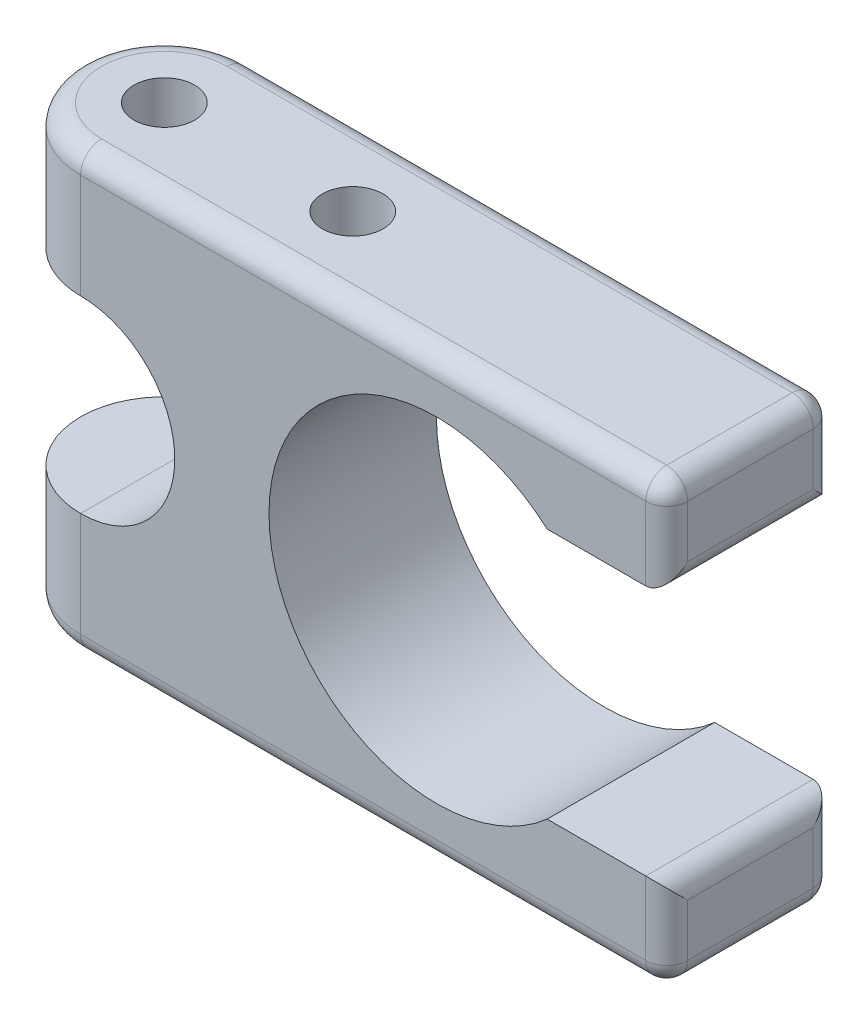
ISO-10303-21;
HEADER;
FILE_DESCRIPTION(('STEP AP214'),'2;1');
FILE_NAME('part.step','',(''),(''),'','','');
FILE_SCHEMA(('AUTOMOTIVE_DESIGN { 1 0 10303 214 1 1 1 1 }'));
ENDSEC;
DATA;
#1=APPLICATION_CONTEXT('core data for automotive mechanical design processes');
#2=APPLICATION_PROTOCOL_DEFINITION('international standard','automotive_design',2000,#1);
#3=PRODUCT_CONTEXT('',#1,'mechanical');
#4=PRODUCT('Part','Part','',(#3));
#5=PRODUCT_RELATED_PRODUCT_CATEGORY('part','',(#4));
#6=PRODUCT_DEFINITION_FORMATION('','',#4);
#7=PRODUCT_DEFINITION_CONTEXT('part definition',#1,'design');
#8=PRODUCT_DEFINITION('design','',#6,#7);
#9=PRODUCT_DEFINITION_SHAPE('','',#8);
#10=(LENGTH_UNIT() NAMED_UNIT(*) SI_UNIT(.MILLI.,.METRE.));
#11=(NAMED_UNIT(*) PLANE_ANGLE_UNIT() SI_UNIT($,.RADIAN.));
#12=(NAMED_UNIT(*) SI_UNIT($,.STERADIAN.) SOLID_ANGLE_UNIT());
#13=UNCERTAINTY_MEASURE_WITH_UNIT(LENGTH_MEASURE(1.E-05),#10,'distance_accuracy_value','');
#14=(GEOMETRIC_REPRESENTATION_CONTEXT(3) GLOBAL_UNCERTAINTY_ASSIGNED_CONTEXT((#13)) GLOBAL_UNIT_ASSIGNED_CONTEXT((#10,
#11,#12)) REPRESENTATION_CONTEXT('',''));
#15=CARTESIAN_POINT('',(0.,0.,0.));
#16=DIRECTION('',(0.,0.,1.));
#17=DIRECTION('',(1.,0.,0.));
#18=AXIS2_PLACEMENT_3D('',#15,#16,#17);
#19=CARTESIAN_POINT('',(-12.,10.5,4.));
#20=DIRECTION('',(0.,-1.,0.));
#21=DIRECTION('',(1.,0.,0.));
#22=AXIS2_PLACEMENT_3D('',#19,#20,#21);
#23=CYLINDRICAL_SURFACE('',#22,4.);
#24=DIRECTION('',(0.,1.,0.));
#25=VECTOR('',#24,1.);
#26=CARTESIAN_POINT('',(-12.,10.5,0.));
#27=LINE('',#26,#25);
#28=CARTESIAN_POINT('',(-12.,4.5,0.));
#29=VERTEX_POINT('',#28);
#30=CARTESIAN_POINT('',(-12.,9.5,0.));
#31=VERTEX_POINT('',#30);
#32=EDGE_CURVE('E203',#29,#31,#27,.T.);
#33=ORIENTED_EDGE('',*,*,#32,.F.);
#34=CARTESIAN_POINT('',(-12.,4.5,4.));
#35=DIRECTION('',(0.,-1.,0.));
#36=DIRECTION('',(1.,0.,0.));
#37=AXIS2_PLACEMENT_3D('',#34,#35,#36);
#38=CIRCLE('',#37,4.);
#39=CARTESIAN_POINT('',(-12.,4.5,8.));
#40=VERTEX_POINT('',#39);
#41=EDGE_CURVE('E182',#40,#29,#38,.T.);
#42=ORIENTED_EDGE('',*,*,#41,.F.);
#43=DIRECTION('',(0.,-1.,0.));
#44=VECTOR('',#43,1.);
#45=CARTESIAN_POINT('',(-12.,0.,8.));
#46=LINE('',#45,#44);
#47=CARTESIAN_POINT('',(-12.,9.5,8.));
#48=VERTEX_POINT('',#47);
#49=EDGE_CURVE('E207',#48,#40,#46,.T.);
#50=ORIENTED_EDGE('',*,*,#49,.F.);
#51=CARTESIAN_POINT('',(-12.,9.5,4.));
#52=DIRECTION('',(0.,-1.,0.));
#53=DIRECTION('',(1.,0.,0.));
#54=AXIS2_PLACEMENT_3D('',#51,#52,#53);
#55=CIRCLE('',#54,4.);
#56=EDGE_CURVE('E225',#48,#31,#55,.T.);
#57=ORIENTED_EDGE('',*,*,#56,.T.);
#58=EDGE_LOOP('',(#33,#42,#50,#57));
#59=FACE_BOUND('',#58,.T.);
#60=ADVANCED_FACE('F37',(#59),#23,.T.);
#61=CARTESIAN_POINT('',(-12.,-4.5,8.));
#62=VERTEX_POINT('',#61);
#63=CARTESIAN_POINT('',(-12.,-9.5,8.));
#64=VERTEX_POINT('',#63);
#65=EDGE_CURVE('E196',#62,#64,#46,.T.);
#66=ORIENTED_EDGE('',*,*,#65,.F.);
#67=CARTESIAN_POINT('',(-12.,-4.5,4.));
#68=DIRECTION('',(0.,1.,0.));
#69=DIRECTION('',(-1.,0.,0.));
#70=AXIS2_PLACEMENT_3D('',#67,#68,#69);
#71=CIRCLE('',#70,4.);
#72=CARTESIAN_POINT('',(-12.,-4.5,0.));
#73=VERTEX_POINT('',#72);
#74=EDGE_CURVE('E187',#73,#62,#71,.T.);
#75=ORIENTED_EDGE('',*,*,#74,.F.);
#76=CARTESIAN_POINT('',(-12.,-9.50000000000001,0.));
#77=VERTEX_POINT('',#76);
#78=EDGE_CURVE('E195',#77,#73,#27,.T.);
#79=ORIENTED_EDGE('',*,*,#78,.F.);
#80=CARTESIAN_POINT('',(-12.,-9.50000000000001,4.));
#81=DIRECTION('',(0.,1.,0.));
#82=DIRECTION('',(-1.,0.,0.));
#83=AXIS2_PLACEMENT_3D('',#80,#81,#82);
#84=CIRCLE('',#83,4.);
#85=EDGE_CURVE('E228',#77,#64,#84,.T.);
#86=ORIENTED_EDGE('',*,*,#85,.T.);
#87=EDGE_LOOP('',(#66,#75,#79,#86));
#88=FACE_BOUND('',#87,.T.);
#89=ADVANCED_FACE('F193',(#88),#23,.T.);
#90=CARTESIAN_POINT('',(16.,10.5,8.));
#91=DIRECTION('',(-1.,0.,0.));
#92=DIRECTION('',(0.,-1.,0.));
#93=AXIS2_PLACEMENT_3D('',#90,#91,#92);
#94=PLANE('',#93);
#95=DIRECTION('',(0.,1.,0.));
#96=VECTOR('',#95,1.);
#97=CARTESIAN_POINT('',(16.,-5.99999999999999,1.));
#98=LINE('',#97,#96);
#99=CARTESIAN_POINT('',(16.,-9.5,1.));
#100=VERTEX_POINT('',#99);
#101=CARTESIAN_POINT('',(16.,-7.,1.));
#102=VERTEX_POINT('',#101);
#103=EDGE_CURVE('E251',#100,#102,#98,.T.);
#104=ORIENTED_EDGE('',*,*,#103,.T.);
#105=DIRECTION('',(0.,0.,1.));
#106=VECTOR('',#105,1.);
#107=CARTESIAN_POINT('',(16.,-7.,8.));
#108=LINE('',#107,#106);
#109=CARTESIAN_POINT('',(16.,-7.,7.));
#110=VERTEX_POINT('',#109);
#111=EDGE_CURVE('E254',#102,#110,#108,.T.);
#112=ORIENTED_EDGE('',*,*,#111,.T.);
#113=DIRECTION('',(0.,1.,0.));
#114=VECTOR('',#113,1.);
#115=CARTESIAN_POINT('',(16.,10.5,7.));
#116=LINE('',#115,#114);
#117=CARTESIAN_POINT('',(16.,-9.5,7.));
#118=VERTEX_POINT('',#117);
#119=EDGE_CURVE('E249',#110,#118,#116,.F.);
#120=ORIENTED_EDGE('',*,*,#119,.T.);
#121=DIRECTION('',(0.,0.,-1.));
#122=VECTOR('',#121,1.);
#123=CARTESIAN_POINT('',(16.,-9.5,8.));
#124=LINE('',#123,#122);
#125=EDGE_CURVE('E247',#118,#100,#124,.T.);
#126=ORIENTED_EDGE('',*,*,#125,.T.);
#127=EDGE_LOOP('',(#104,#112,#120,#126));
#128=FACE_BOUND('',#127,.T.);
#129=ADVANCED_FACE('F424',(#128),#94,.F.);
#130=CARTESIAN_POINT('',(16.,-10.5,8.));
#131=DIRECTION('',(0.,1.,0.));
#132=DIRECTION('',(-1.,0.,0.));
#133=AXIS2_PLACEMENT_3D('',#130,#131,#132);
#134=PLANE('',#133);
#135=CARTESIAN_POINT('',(-12.,-10.5,4.));
#136=DIRECTION('',(0.,-1.,0.));
#137=DIRECTION('',(0.,0.,-1.));
#138=AXIS2_PLACEMENT_3D('',#135,#136,#137);
#139=CIRCLE('',#138,1.44999999999999);
#140=CARTESIAN_POINT('',(-12.,-10.5,2.55000000000001));
#141=VERTEX_POINT('',#140);
#142=EDGE_CURVE('E403',#141,#141,#139,.T.);
#143=ORIENTED_EDGE('',*,*,#142,.F.);
#144=EDGE_LOOP('',(#143));
#145=FACE_BOUND('',#144,.T.);
#146=CARTESIAN_POINT('',(-3.,-10.5,4.));
#147=DIRECTION('',(0.,-1.,0.));
#148=DIRECTION('',(0.,0.,-1.));
#149=AXIS2_PLACEMENT_3D('',#146,#147,#148);
#150=CIRCLE('',#149,1.44999999999999);
#151=CARTESIAN_POINT('',(-3.,-10.5,2.55000000000001));
#152=VERTEX_POINT('',#151);
#153=EDGE_CURVE('E397',#152,#152,#150,.T.);
#154=ORIENTED_EDGE('',*,*,#153,.F.);
#155=EDGE_LOOP('',(#154));
#156=FACE_BOUND('',#155,.T.);
#157=CARTESIAN_POINT('',(-12.,-10.5,4.));
#158=DIRECTION('',(0.,1.,0.));
#159=DIRECTION('',(-1.,0.,0.));
#160=AXIS2_PLACEMENT_3D('',#157,#158,#159);
#161=CIRCLE('',#160,3.);
#162=CARTESIAN_POINT('',(-12.,-10.5,7.));
#163=VERTEX_POINT('',#162);
#164=CARTESIAN_POINT('',(-12.,-10.5,1.));
#165=VERTEX_POINT('',#164);
#166=EDGE_CURVE('E212',#163,#165,#161,.F.);
#167=ORIENTED_EDGE('',*,*,#166,.T.);
#168=DIRECTION('',(1.,0.,0.));
#169=VECTOR('',#168,1.);
#170=CARTESIAN_POINT('',(16.,-10.5,1.));
#171=LINE('',#170,#169);
#172=CARTESIAN_POINT('',(15.,-10.5,1.));
#173=VERTEX_POINT('',#172);
#174=EDGE_CURVE('E214',#165,#173,#171,.T.);
#175=ORIENTED_EDGE('',*,*,#174,.T.);
#176=DIRECTION('',(0.,0.,-1.));
#177=VECTOR('',#176,1.);
#178=CARTESIAN_POINT('',(15.,-10.5,8.));
#179=LINE('',#178,#177);
#180=CARTESIAN_POINT('',(15.,-10.5,7.));
#181=VERTEX_POINT('',#180);
#182=EDGE_CURVE('E205',#173,#181,#179,.F.);
#183=ORIENTED_EDGE('',*,*,#182,.T.);
#184=DIRECTION('',(1.,0.,0.));
#185=VECTOR('',#184,1.);
#186=CARTESIAN_POINT('',(16.,-10.5,7.));
#187=LINE('',#186,#185);
#188=EDGE_CURVE('E202',#181,#163,#187,.F.);
#189=ORIENTED_EDGE('',*,*,#188,.T.);
#190=EDGE_LOOP('',(#167,#175,#183,#189));
#191=FACE_BOUND('',#190,.T.);
#192=ADVANCED_FACE('F430',(#145,#156,#191),#134,.F.);
#193=DIRECTION('',(0.,1.,0.));
#194=VECTOR('',#193,1.);
#195=CARTESIAN_POINT('',(16.,10.5,7.));
#196=LINE('',#195,#194);
#197=CARTESIAN_POINT('',(16.,9.5,7.));
#198=VERTEX_POINT('',#197);
#199=CARTESIAN_POINT('',(16.,7.,7.));
#200=VERTEX_POINT('',#199);
#201=EDGE_CURVE('E262',#198,#200,#196,.F.);
#202=ORIENTED_EDGE('',*,*,#201,.T.);
#203=DIRECTION('',(0.,0.,1.));
#204=VECTOR('',#203,1.);
#205=CARTESIAN_POINT('',(16.,7.,8.));
#206=LINE('',#205,#204);
#207=CARTESIAN_POINT('',(16.,7.,1.));
#208=VERTEX_POINT('',#207);
#209=EDGE_CURVE('E11',#200,#208,#206,.F.);
#210=ORIENTED_EDGE('',*,*,#209,.T.);
#211=DIRECTION('',(0.,1.,0.));
#212=VECTOR('',#211,1.);
#213=CARTESIAN_POINT('',(16.,10.5,1.));
#214=LINE('',#213,#212);
#215=CARTESIAN_POINT('',(16.,9.5,1.));
#216=VERTEX_POINT('',#215);
#217=EDGE_CURVE('E46',#208,#216,#214,.T.);
#218=ORIENTED_EDGE('',*,*,#217,.T.);
#219=DIRECTION('',(0.,0.,-1.));
#220=VECTOR('',#219,1.);
#221=CARTESIAN_POINT('',(16.,9.5,8.));
#222=LINE('',#221,#220);
#223=EDGE_CURVE('E260',#216,#198,#222,.F.);
#224=ORIENTED_EDGE('',*,*,#223,.T.);
#225=EDGE_LOOP('',(#202,#210,#218,#224));
#226=FACE_BOUND('',#225,.T.);
#227=ADVANCED_FACE('F604',(#226),#94,.F.);
#228=CARTESIAN_POINT('',(16.,10.5,8.));
#229=DIRECTION('',(0.,-1.,0.));
#230=DIRECTION('',(1.,0.,0.));
#231=AXIS2_PLACEMENT_3D('',#228,#229,#230);
#232=PLANE('',#231);
#233=DIRECTION('',(-1.,0.,0.));
#234=VECTOR('',#233,1.);
#235=CARTESIAN_POINT('',(16.,10.5,7.));
#236=LINE('',#235,#234);
#237=CARTESIAN_POINT('',(-12.,10.5,7.));
#238=VERTEX_POINT('',#237);
#239=CARTESIAN_POINT('',(15.,10.5,7.));
#240=VERTEX_POINT('',#239);
#241=EDGE_CURVE('E232',#238,#240,#236,.F.);
#242=ORIENTED_EDGE('',*,*,#241,.T.);
#243=DIRECTION('',(0.,0.,-1.));
#244=VECTOR('',#243,1.);
#245=CARTESIAN_POINT('',(15.,10.5,8.));
#246=LINE('',#245,#244);
#247=CARTESIAN_POINT('',(15.,10.5,1.));
#248=VERTEX_POINT('',#247);
#249=EDGE_CURVE('E237',#240,#248,#246,.T.);
#250=ORIENTED_EDGE('',*,*,#249,.T.);
#251=DIRECTION('',(-1.,0.,0.));
#252=VECTOR('',#251,1.);
#253=CARTESIAN_POINT('',(-12.,10.5,1.));
#254=LINE('',#253,#252);
#255=CARTESIAN_POINT('',(-12.,10.5,1.));
#256=VERTEX_POINT('',#255);
#257=EDGE_CURVE('E234',#248,#256,#254,.T.);
#258=ORIENTED_EDGE('',*,*,#257,.T.);
#259=CARTESIAN_POINT('',(-12.,10.5,4.));
#260=DIRECTION('',(0.,-1.,0.));
#261=DIRECTION('',(1.,0.,0.));
#262=AXIS2_PLACEMENT_3D('',#259,#260,#261);
#263=CIRCLE('',#262,3.);
#264=EDGE_CURVE('E230',#256,#238,#263,.F.);
#265=ORIENTED_EDGE('',*,*,#264,.T.);
#266=EDGE_LOOP('',(#242,#250,#258,#265));
#267=FACE_BOUND('',#266,.T.);
#268=CARTESIAN_POINT('',(-12.,10.5,4.));
#269=DIRECTION('',(0.,1.,0.));
#270=DIRECTION('',(0.,0.,1.));
#271=AXIS2_PLACEMENT_3D('',#268,#269,#270);
#272=CIRCLE('',#271,1.44999999999999);
#273=CARTESIAN_POINT('',(-12.,10.5,5.44999999999999));
#274=VERTEX_POINT('',#273);
#275=EDGE_CURVE('E292',#274,#274,#272,.T.);
#276=ORIENTED_EDGE('',*,*,#275,.F.);
#277=EDGE_LOOP('',(#276));
#278=FACE_BOUND('',#277,.T.);
#279=CARTESIAN_POINT('',(-3.,10.5,4.));
#280=DIRECTION('',(0.,1.,0.));
#281=DIRECTION('',(0.,0.,1.));
#282=AXIS2_PLACEMENT_3D('',#279,#280,#281);
#283=CIRCLE('',#282,1.44999999999999);
#284=CARTESIAN_POINT('',(-3.,10.5,5.44999999999999));
#285=VERTEX_POINT('',#284);
#286=EDGE_CURVE('E385',#285,#285,#283,.T.);
#287=ORIENTED_EDGE('',*,*,#286,.F.);
#288=EDGE_LOOP('',(#287));
#289=FACE_BOUND('',#288,.T.);
#290=ADVANCED_FACE('F597',(#267,#278,#289),#232,.F.);
#291=CARTESIAN_POINT('',(0.,0.,8.));
#292=DIRECTION('',(0.,0.,-1.));
#293=DIRECTION('',(-1.,0.,0.));
#294=AXIS2_PLACEMENT_3D('',#291,#292,#293);
#295=PLANE('',#294);
#296=CARTESIAN_POINT('',(-12.,0.,8.));
#297=DIRECTION('',(0.,0.,-1.));
#298=DIRECTION('',(-1.,0.,0.));
#299=AXIS2_PLACEMENT_3D('',#296,#297,#298);
#300=CIRCLE('',#299,4.5);
#301=EDGE_CURVE('E360',#40,#62,#300,.T.);
#302=ORIENTED_EDGE('',*,*,#301,.T.);
#303=ORIENTED_EDGE('',*,*,#65,.T.);
#304=DIRECTION('',(1.,0.,0.));
#305=VECTOR('',#304,1.);
#306=CARTESIAN_POINT('',(0.,-9.5,8.));
#307=LINE('',#306,#305);
#308=CARTESIAN_POINT('',(15.,-9.5,8.));
#309=VERTEX_POINT('',#308);
#310=EDGE_CURVE('E239',#64,#309,#307,.T.);
#311=ORIENTED_EDGE('',*,*,#310,.T.);
#312=DIRECTION('',(0.,1.,0.));
#313=VECTOR('',#312,1.);
#314=CARTESIAN_POINT('',(15.,0.,8.));
#315=LINE('',#314,#313);
#316=CARTESIAN_POINT('',(15.,-6.,8.));
#317=VERTEX_POINT('',#316);
#318=EDGE_CURVE('E241',#309,#317,#315,.T.);
#319=ORIENTED_EDGE('',*,*,#318,.T.);
#320=DIRECTION('',(1.,0.,0.));
#321=VECTOR('',#320,1.);
#322=CARTESIAN_POINT('',(16.,-6.,8.));
#323=LINE('',#322,#321);
#324=CARTESIAN_POINT('',(10.2915026221292,-6.,8.));
#325=VERTEX_POINT('',#324);
#326=EDGE_CURVE('E345',#325,#317,#323,.T.);
#327=ORIENTED_EDGE('',*,*,#326,.F.);
#328=CARTESIAN_POINT('',(5.,0.,8.));
#329=DIRECTION('',(0.,0.,1.));
#330=DIRECTION('',(1.,0.,0.));
#331=AXIS2_PLACEMENT_3D('',#328,#329,#330);
#332=CIRCLE('',#331,8.);
#333=CARTESIAN_POINT('',(10.2915026221292,6.,8.));
#334=VERTEX_POINT('',#333);
#335=EDGE_CURVE('E339',#334,#325,#332,.T.);
#336=ORIENTED_EDGE('',*,*,#335,.F.);
#337=DIRECTION('',(-1.,0.,0.));
#338=VECTOR('',#337,1.);
#339=CARTESIAN_POINT('',(16.,6.,8.));
#340=LINE('',#339,#338);
#341=CARTESIAN_POINT('',(15.,6.,8.));
#342=VERTEX_POINT('',#341);
#343=EDGE_CURVE('E336',#342,#334,#340,.T.);
#344=ORIENTED_EDGE('',*,*,#343,.F.);
#345=DIRECTION('',(0.,1.,0.));
#346=VECTOR('',#345,1.);
#347=CARTESIAN_POINT('',(15.,0.,8.));
#348=LINE('',#347,#346);
#349=CARTESIAN_POINT('',(15.,9.5,8.));
#350=VERTEX_POINT('',#349);
#351=EDGE_CURVE('E243',#342,#350,#348,.T.);
#352=ORIENTED_EDGE('',*,*,#351,.T.);
#353=DIRECTION('',(-1.,0.,0.));
#354=VECTOR('',#353,1.);
#355=CARTESIAN_POINT('',(0.,9.5,8.));
#356=LINE('',#355,#354);
#357=EDGE_CURVE('E245',#350,#48,#356,.T.);
#358=ORIENTED_EDGE('',*,*,#357,.T.);
#359=ORIENTED_EDGE('',*,*,#49,.T.);
#360=EDGE_LOOP('',(#302,#303,#311,#319,#327,#336,#344,#352,#358,#359));
#361=FACE_BOUND('',#360,.T.);
#362=ADVANCED_FACE('F331',(#361),#295,.F.);
#363=CARTESIAN_POINT('',(0.,0.,0.));
#364=DIRECTION('',(0.,0.,-1.));
#365=DIRECTION('',(-1.,0.,0.));
#366=AXIS2_PLACEMENT_3D('',#363,#364,#365);
#367=PLANE('',#366);
#368=ORIENTED_EDGE('',*,*,#78,.T.);
#369=CARTESIAN_POINT('',(-12.,0.,0.));
#370=DIRECTION('',(0.,0.,1.));
#371=DIRECTION('',(1.,0.,0.));
#372=AXIS2_PLACEMENT_3D('',#369,#370,#371);
#373=CIRCLE('',#372,4.5);
#374=EDGE_CURVE('E174',#73,#29,#373,.T.);
#375=ORIENTED_EDGE('',*,*,#374,.T.);
#376=ORIENTED_EDGE('',*,*,#32,.T.);
#377=DIRECTION('',(-1.,0.,0.));
#378=VECTOR('',#377,1.);
#379=CARTESIAN_POINT('',(16.,9.5,0.));
#380=LINE('',#379,#378);
#381=CARTESIAN_POINT('',(15.,9.5,0.));
#382=VERTEX_POINT('',#381);
#383=EDGE_CURVE('E219',#31,#382,#380,.F.);
#384=ORIENTED_EDGE('',*,*,#383,.T.);
#385=DIRECTION('',(0.,1.,0.));
#386=VECTOR('',#385,1.);
#387=CARTESIAN_POINT('',(15.,6.,0.));
#388=LINE('',#387,#386);
#389=CARTESIAN_POINT('',(15.,6.,0.));
#390=VERTEX_POINT('',#389);
#391=EDGE_CURVE('E217',#382,#390,#388,.F.);
#392=ORIENTED_EDGE('',*,*,#391,.T.);
#393=DIRECTION('',(-1.,0.,0.));
#394=VECTOR('',#393,1.);
#395=CARTESIAN_POINT('',(16.,6.,0.));
#396=LINE('',#395,#394);
#397=CARTESIAN_POINT('',(10.2915026221292,6.,0.));
#398=VERTEX_POINT('',#397);
#399=EDGE_CURVE('E357',#390,#398,#396,.T.);
#400=ORIENTED_EDGE('',*,*,#399,.T.);
#401=CARTESIAN_POINT('',(5.,0.,0.));
#402=DIRECTION('',(0.,0.,-1.));
#403=DIRECTION('',(-1.,0.,0.));
#404=AXIS2_PLACEMENT_3D('',#401,#402,#403);
#405=CIRCLE('',#404,8.);
#406=CARTESIAN_POINT('',(10.2915026221292,-6.,0.));
#407=VERTEX_POINT('',#406);
#408=EDGE_CURVE('E348',#398,#407,#405,.F.);
#409=ORIENTED_EDGE('',*,*,#408,.T.);
#410=DIRECTION('',(1.,0.,0.));
#411=VECTOR('',#410,1.);
#412=CARTESIAN_POINT('',(16.,-6.,0.));
#413=LINE('',#412,#411);
#414=CARTESIAN_POINT('',(15.,-6.,0.));
#415=VERTEX_POINT('',#414);
#416=EDGE_CURVE('E343',#407,#415,#413,.T.);
#417=ORIENTED_EDGE('',*,*,#416,.T.);
#418=DIRECTION('',(0.,1.,0.));
#419=VECTOR('',#418,1.);
#420=CARTESIAN_POINT('',(15.,-10.5,0.));
#421=LINE('',#420,#419);
#422=CARTESIAN_POINT('',(15.,-9.5,0.));
#423=VERTEX_POINT('',#422);
#424=EDGE_CURVE('E222',#415,#423,#421,.F.);
#425=ORIENTED_EDGE('',*,*,#424,.T.);
#426=DIRECTION('',(1.,0.,0.));
#427=VECTOR('',#426,1.);
#428=CARTESIAN_POINT('',(-12.,-9.5,0.));
#429=LINE('',#428,#427);
#430=EDGE_CURVE('E201',#423,#77,#429,.F.);
#431=ORIENTED_EDGE('',*,*,#430,.T.);
#432=EDGE_LOOP('',(#368,#375,#376,#384,#392,#400,#409,#417,#425,#431));
#433=FACE_BOUND('',#432,.T.);
#434=ADVANCED_FACE('F199',(#433),#367,.T.);
#435=CARTESIAN_POINT('',(16.,-6.,-0.000999999999999265));
#436=DIRECTION('',(0.,-1.,0.));
#437=DIRECTION('',(0.,0.,-1.));
#438=AXIS2_PLACEMENT_3D('',#435,#436,#437);
#439=PLANE('',#438);
#440=ORIENTED_EDGE('',*,*,#326,.T.);
#441=DIRECTION('',(0.,0.,1.));
#442=VECTOR('',#441,1.);
#443=CARTESIAN_POINT('',(15.,-6.,-0.000999999999999265));
#444=LINE('',#443,#442);
#445=EDGE_CURVE('E256',#317,#415,#444,.F.);
#446=ORIENTED_EDGE('',*,*,#445,.T.);
#447=ORIENTED_EDGE('',*,*,#416,.F.);
#448=DIRECTION('',(0.,0.,1.));
#449=VECTOR('',#448,1.);
#450=CARTESIAN_POINT('',(10.2915026221292,-6.,-0.000999999999999265));
#451=LINE('',#450,#449);
#452=EDGE_CURVE('E355',#407,#325,#451,.T.);
#453=ORIENTED_EDGE('',*,*,#452,.T.);
#454=EDGE_LOOP('',(#440,#446,#447,#453));
#455=FACE_BOUND('',#454,.T.);
#456=ADVANCED_FACE('F576',(#455),#439,.F.);
#457=CARTESIAN_POINT('',(5.,0.,-0.000999999999999265));
#458=DIRECTION('',(0.,0.,1.));
#459=DIRECTION('',(1.,0.,0.));
#460=AXIS2_PLACEMENT_3D('',#457,#458,#459);
#461=CYLINDRICAL_SURFACE('',#460,8.);
#462=DIRECTION('',(0.,0.,1.));
#463=VECTOR('',#462,1.);
#464=CARTESIAN_POINT('',(10.2915026221292,6.,-0.000999999999999265));
#465=LINE('',#464,#463);
#466=EDGE_CURVE('E354',#398,#334,#465,.T.);
#467=ORIENTED_EDGE('',*,*,#466,.T.);
#468=ORIENTED_EDGE('',*,*,#335,.T.);
#469=ORIENTED_EDGE('',*,*,#452,.F.);
#470=ORIENTED_EDGE('',*,*,#408,.F.);
#471=EDGE_LOOP('',(#467,#468,#469,#470));
#472=FACE_BOUND('',#471,.T.);
#473=ADVANCED_FACE('F382',(#472),#461,.F.);
#474=CARTESIAN_POINT('',(16.,6.,-0.000999999999999265));
#475=DIRECTION('',(0.,1.,0.));
#476=DIRECTION('',(0.,0.,1.));
#477=AXIS2_PLACEMENT_3D('',#474,#475,#476);
#478=PLANE('',#477);
#479=ORIENTED_EDGE('',*,*,#399,.F.);
#480=DIRECTION('',(0.,0.,1.));
#481=VECTOR('',#480,1.);
#482=CARTESIAN_POINT('',(15.,6.,-0.000999999999999265));
#483=LINE('',#482,#481);
#484=EDGE_CURVE('E258',#390,#342,#483,.T.);
#485=ORIENTED_EDGE('',*,*,#484,.T.);
#486=ORIENTED_EDGE('',*,*,#343,.T.);
#487=ORIENTED_EDGE('',*,*,#466,.F.);
#488=EDGE_LOOP('',(#479,#485,#486,#487));
#489=FACE_BOUND('',#488,.T.);
#490=ADVANCED_FACE('F378',(#489),#478,.F.);
#491=CARTESIAN_POINT('',(-3.,6.5,4.));
#492=DIRECTION('',(0.,1.,0.));
#493=DIRECTION('',(0.,0.,1.));
#494=AXIS2_PLACEMENT_3D('',#491,#492,#493);
#495=CONICAL_SURFACE('',#494,1.45,1.02974425867665);
#496=CARTESIAN_POINT('',(-3.,5.62875210241004,4.));
#497=VERTEX_POINT('',#496);
#498=VERTEX_LOOP('',#497);
#499=FACE_BOUND('',#498,.T.);
#500=CARTESIAN_POINT('',(-3.,6.5,4.));
#501=DIRECTION('',(0.,1.,0.));
#502=DIRECTION('',(0.,0.,1.));
#503=AXIS2_PLACEMENT_3D('',#500,#501,#502);
#504=CIRCLE('',#503,1.45);
#505=CARTESIAN_POINT('',(-3.,6.5,5.45));
#506=VERTEX_POINT('',#505);
#507=EDGE_CURVE('E383',#506,#506,#504,.T.);
#508=ORIENTED_EDGE('',*,*,#507,.T.);
#509=EDGE_LOOP('',(#508));
#510=FACE_BOUND('',#509,.T.);
#511=ADVANCED_FACE('F555',(#499,#510),#495,.F.);
#512=CARTESIAN_POINT('',(-3.,10.5,4.));
#513=DIRECTION('',(0.,1.,0.));
#514=DIRECTION('',(0.,0.,1.));
#515=AXIS2_PLACEMENT_3D('',#512,#513,#514);
#516=CYLINDRICAL_SURFACE('',#515,1.44999999999999);
#517=ORIENTED_EDGE('',*,*,#507,.F.);
#518=EDGE_LOOP('',(#517));
#519=FACE_BOUND('',#518,.T.);
#520=ORIENTED_EDGE('',*,*,#286,.T.);
#521=EDGE_LOOP('',(#520));
#522=FACE_BOUND('',#521,.T.);
#523=ADVANCED_FACE('F547',(#519,#522),#516,.F.);
#524=CARTESIAN_POINT('',(-12.,6.5,4.));
#525=DIRECTION('',(0.,1.,0.));
#526=DIRECTION('',(0.,0.,1.));
#527=AXIS2_PLACEMENT_3D('',#524,#525,#526);
#528=CONICAL_SURFACE('',#527,1.45,1.02974425867665);
#529=CARTESIAN_POINT('',(-12.,5.62875210241004,4.));
#530=VERTEX_POINT('',#529);
#531=VERTEX_LOOP('',#530);
#532=FACE_BOUND('',#531,.T.);
#533=CARTESIAN_POINT('',(-12.,6.5,4.));
#534=DIRECTION('',(0.,1.,0.));
#535=DIRECTION('',(0.,0.,1.));
#536=AXIS2_PLACEMENT_3D('',#533,#534,#535);
#537=CIRCLE('',#536,1.45);
#538=CARTESIAN_POINT('',(-12.,6.5,5.45));
#539=VERTEX_POINT('',#538);
#540=EDGE_CURVE('E390',#539,#539,#537,.T.);
#541=ORIENTED_EDGE('',*,*,#540,.T.);
#542=EDGE_LOOP('',(#541));
#543=FACE_BOUND('',#542,.T.);
#544=ADVANCED_FACE('F538',(#532,#543),#528,.F.);
#545=CARTESIAN_POINT('',(-12.,10.5,4.));
#546=DIRECTION('',(0.,1.,0.));
#547=DIRECTION('',(0.,0.,1.));
#548=AXIS2_PLACEMENT_3D('',#545,#546,#547);
#549=CYLINDRICAL_SURFACE('',#548,1.44999999999999);
#550=ORIENTED_EDGE('',*,*,#540,.F.);
#551=EDGE_LOOP('',(#550));
#552=FACE_BOUND('',#551,.T.);
#553=ORIENTED_EDGE('',*,*,#275,.T.);
#554=EDGE_LOOP('',(#553));
#555=FACE_BOUND('',#554,.T.);
#556=ADVANCED_FACE('F467',(#552,#555),#549,.F.);
#557=CARTESIAN_POINT('',(15.,0.,7.));
#558=DIRECTION('',(0.,1.,0.));
#559=DIRECTION('',(-1.,0.,0.));
#560=AXIS2_PLACEMENT_3D('',#557,#558,#559);
#561=CYLINDRICAL_SURFACE('',#560,1.);
#562=CARTESIAN_POINT('',(15.,-9.5,7.));
#563=DIRECTION('',(0.,-1.,0.));
#564=DIRECTION('',(0.,0.,-1.));
#565=AXIS2_PLACEMENT_3D('',#562,#563,#564);
#566=CIRCLE('',#565,1.);
#567=EDGE_CURVE('E289',#118,#309,#566,.T.);
#568=ORIENTED_EDGE('',*,*,#567,.F.);
#569=ORIENTED_EDGE('',*,*,#119,.F.);
#570=CARTESIAN_POINT('',(15.,-7.,7.));
#571=DIRECTION('',(0.,-0.707106781186547,0.707106781186547));
#572=DIRECTION('',(0.,0.707106781186547,0.707106781186547));
#573=AXIS2_PLACEMENT_3D('',#570,#571,#572);
#574=ELLIPSE('',#573,1.41421356237309,1.);
#575=EDGE_CURVE('E286',#317,#110,#574,.F.);
#576=ORIENTED_EDGE('',*,*,#575,.F.);
#577=ORIENTED_EDGE('',*,*,#318,.F.);
#578=EDGE_LOOP('',(#568,#569,#576,#577));
#579=FACE_BOUND('',#578,.T.);
#580=ADVANCED_FACE('F463',(#579),#561,.T.);
#581=CARTESIAN_POINT('',(15.,-9.5,7.));
#582=DIRECTION('',(0.,0.,1.));
#583=DIRECTION('',(1.,0.,0.));
#584=AXIS2_PLACEMENT_3D('',#581,#582,#583);
#585=SPHERICAL_SURFACE('',#584,1.);
#586=CARTESIAN_POINT('',(15.,-9.5,7.));
#587=DIRECTION('',(0.,0.,1.));
#588=DIRECTION('',(1.,0.,0.));
#589=AXIS2_PLACEMENT_3D('',#586,#587,#588);
#590=CIRCLE('',#589,1.);
#591=EDGE_CURVE('E280',#118,#181,#590,.F.);
#592=ORIENTED_EDGE('',*,*,#591,.F.);
#593=ORIENTED_EDGE('',*,*,#567,.T.);
#594=CARTESIAN_POINT('',(15.,-9.5,7.));
#595=DIRECTION('',(1.,0.,0.));
#596=DIRECTION('',(0.,0.,-1.));
#597=AXIS2_PLACEMENT_3D('',#594,#595,#596);
#598=CIRCLE('',#597,1.);
#599=EDGE_CURVE('E283',#181,#309,#598,.F.);
#600=ORIENTED_EDGE('',*,*,#599,.F.);
#601=EDGE_LOOP('',(#592,#593,#600));
#602=FACE_BOUND('',#601,.T.);
#603=ADVANCED_FACE('F459',(#602),#585,.T.);
#604=CARTESIAN_POINT('',(15.,-7.,8.));
#605=DIRECTION('',(0.,0.,1.));
#606=DIRECTION('',(1.,0.,0.));
#607=AXIS2_PLACEMENT_3D('',#604,#605,#606);
#608=CYLINDRICAL_SURFACE('',#607,1.);
#609=ORIENTED_EDGE('',*,*,#575,.T.);
#610=ORIENTED_EDGE('',*,*,#111,.F.);
#611=CARTESIAN_POINT('',(15.,-7.,1.));
#612=DIRECTION('',(0.,0.707106781186547,0.707106781186547));
#613=DIRECTION('',(0.,-0.707106781186547,0.707106781186547));
#614=AXIS2_PLACEMENT_3D('',#611,#612,#613);
#615=ELLIPSE('',#614,1.41421356237309,1.);
#616=EDGE_CURVE('E278',#415,#102,#615,.F.);
#617=ORIENTED_EDGE('',*,*,#616,.F.);
#618=ORIENTED_EDGE('',*,*,#445,.F.);
#619=EDGE_LOOP('',(#609,#610,#617,#618));
#620=FACE_BOUND('',#619,.T.);
#621=ADVANCED_FACE('F455',(#620),#608,.T.);
#622=CARTESIAN_POINT('',(0.,-9.5,7.));
#623=DIRECTION('',(1.,0.,0.));
#624=DIRECTION('',(0.,1.,0.));
#625=AXIS2_PLACEMENT_3D('',#622,#623,#624);
#626=CYLINDRICAL_SURFACE('',#625,1.);
#627=ORIENTED_EDGE('',*,*,#599,.T.);
#628=ORIENTED_EDGE('',*,*,#310,.F.);
#629=CARTESIAN_POINT('',(-12.,-9.5,7.));
#630=DIRECTION('',(-1.,0.,0.));
#631=DIRECTION('',(0.,0.,1.));
#632=AXIS2_PLACEMENT_3D('',#629,#630,#631);
#633=CIRCLE('',#632,1.);
#634=EDGE_CURVE('E275',#163,#64,#633,.T.);
#635=ORIENTED_EDGE('',*,*,#634,.F.);
#636=ORIENTED_EDGE('',*,*,#188,.F.);
#637=EDGE_LOOP('',(#627,#628,#635,#636));
#638=FACE_BOUND('',#637,.T.);
#639=ADVANCED_FACE('F451',(#638),#626,.T.);
#640=CARTESIAN_POINT('',(15.,-9.5,8.));
#641=DIRECTION('',(0.,0.,-1.));
#642=DIRECTION('',(-1.,0.,0.));
#643=AXIS2_PLACEMENT_3D('',#640,#641,#642);
#644=CYLINDRICAL_SURFACE('',#643,1.);
#645=ORIENTED_EDGE('',*,*,#591,.T.);
#646=ORIENTED_EDGE('',*,*,#182,.F.);
#647=CARTESIAN_POINT('',(15.,-9.5,1.));
#648=DIRECTION('',(0.,0.,-1.));
#649=DIRECTION('',(-1.,0.,0.));
#650=AXIS2_PLACEMENT_3D('',#647,#648,#649);
#651=CIRCLE('',#650,1.);
#652=EDGE_CURVE('E272',#100,#173,#651,.T.);
#653=ORIENTED_EDGE('',*,*,#652,.F.);
#654=ORIENTED_EDGE('',*,*,#125,.F.);
#655=EDGE_LOOP('',(#645,#646,#653,#654));
#656=FACE_BOUND('',#655,.T.);
#657=ADVANCED_FACE('F447',(#656),#644,.T.);
#658=CARTESIAN_POINT('',(15.,10.5,1.));
#659=DIRECTION('',(0.,-1.,0.));
#660=DIRECTION('',(1.,0.,0.));
#661=AXIS2_PLACEMENT_3D('',#658,#659,#660);
#662=CYLINDRICAL_SURFACE('',#661,1.);
#663=ORIENTED_EDGE('',*,*,#616,.T.);
#664=ORIENTED_EDGE('',*,*,#103,.F.);
#665=CARTESIAN_POINT('',(15.,-9.5,1.));
#666=DIRECTION('',(0.,-1.,0.));
#667=DIRECTION('',(0.,0.,-1.));
#668=AXIS2_PLACEMENT_3D('',#665,#666,#667);
#669=CIRCLE('',#668,1.);
#670=EDGE_CURVE('E269',#423,#100,#669,.T.);
#671=ORIENTED_EDGE('',*,*,#670,.F.);
#672=ORIENTED_EDGE('',*,*,#424,.F.);
#673=EDGE_LOOP('',(#663,#664,#671,#672));
#674=FACE_BOUND('',#673,.T.);
#675=ADVANCED_FACE('F443',(#674),#662,.T.);
#676=CARTESIAN_POINT('',(-12.,-9.5,4.));
#677=DIRECTION('',(0.,1.,0.));
#678=DIRECTION('',(-1.,0.,0.));
#679=AXIS2_PLACEMENT_3D('',#676,#677,#678);
#680=TOROIDAL_SURFACE('',#679,3.,1.);
#681=ORIENTED_EDGE('',*,*,#634,.T.);
#682=ORIENTED_EDGE('',*,*,#85,.F.);
#683=CARTESIAN_POINT('',(-12.,-9.5,1.));
#684=DIRECTION('',(1.,0.,0.));
#685=DIRECTION('',(0.,0.,-1.));
#686=AXIS2_PLACEMENT_3D('',#683,#684,#685);
#687=CIRCLE('',#686,1.);
#688=EDGE_CURVE('E267',#165,#77,#687,.T.);
#689=ORIENTED_EDGE('',*,*,#688,.F.);
#690=ORIENTED_EDGE('',*,*,#166,.F.);
#691=EDGE_LOOP('',(#681,#682,#689,#690));
#692=FACE_BOUND('',#691,.T.);
#693=ADVANCED_FACE('F439',(#692),#680,.T.);
#694=CARTESIAN_POINT('',(15.,-9.5,1.));
#695=DIRECTION('',(0.,0.,1.));
#696=DIRECTION('',(1.,0.,0.));
#697=AXIS2_PLACEMENT_3D('',#694,#695,#696);
#698=SPHERICAL_SURFACE('',#697,1.);
#699=ORIENTED_EDGE('',*,*,#670,.T.);
#700=ORIENTED_EDGE('',*,*,#652,.T.);
#701=CARTESIAN_POINT('',(15.,-9.5,1.));
#702=DIRECTION('',(1.,0.,0.));
#703=DIRECTION('',(0.,0.,-1.));
#704=AXIS2_PLACEMENT_3D('',#701,#702,#703);
#705=CIRCLE('',#704,1.);
#706=EDGE_CURVE('E265',#423,#173,#705,.F.);
#707=ORIENTED_EDGE('',*,*,#706,.F.);
#708=EDGE_LOOP('',(#699,#700,#707));
#709=FACE_BOUND('',#708,.T.);
#710=ADVANCED_FACE('F435',(#709),#698,.T.);
#711=CARTESIAN_POINT('',(16.,-9.5,1.));
#712=DIRECTION('',(-1.,0.,0.));
#713=DIRECTION('',(0.,-1.,0.));
#714=AXIS2_PLACEMENT_3D('',#711,#712,#713);
#715=CYLINDRICAL_SURFACE('',#714,1.);
#716=ORIENTED_EDGE('',*,*,#688,.T.);
#717=ORIENTED_EDGE('',*,*,#430,.F.);
#718=ORIENTED_EDGE('',*,*,#706,.T.);
#719=ORIENTED_EDGE('',*,*,#174,.F.);
#720=EDGE_LOOP('',(#716,#717,#718,#719));
#721=FACE_BOUND('',#720,.T.);
#722=ADVANCED_FACE('F432',(#721),#715,.T.);
#723=CARTESIAN_POINT('',(15.,0.,7.));
#724=DIRECTION('',(0.,1.,0.));
#725=DIRECTION('',(-1.,0.,0.));
#726=AXIS2_PLACEMENT_3D('',#723,#724,#725);
#727=CYLINDRICAL_SURFACE('',#726,1.);
#728=CARTESIAN_POINT('',(15.,9.5,7.));
#729=DIRECTION('',(0.,1.,0.));
#730=DIRECTION('',(0.,0.,1.));
#731=AXIS2_PLACEMENT_3D('',#728,#729,#730);
#732=CIRCLE('',#731,1.);
#733=EDGE_CURVE('E314',#350,#198,#732,.T.);
#734=ORIENTED_EDGE('',*,*,#733,.F.);
#735=ORIENTED_EDGE('',*,*,#351,.F.);
#736=CARTESIAN_POINT('',(15.,7.,7.));
#737=DIRECTION('',(0.,0.707106781186547,0.707106781186547));
#738=DIRECTION('',(0.,0.707106781186547,-0.707106781186547));
#739=AXIS2_PLACEMENT_3D('',#736,#737,#738);
#740=ELLIPSE('',#739,1.41421356237309,1.);
#741=EDGE_CURVE('E41',#200,#342,#740,.F.);
#742=ORIENTED_EDGE('',*,*,#741,.F.);
#743=ORIENTED_EDGE('',*,*,#201,.F.);
#744=EDGE_LOOP('',(#734,#735,#742,#743));
#745=FACE_BOUND('',#744,.T.);
#746=ADVANCED_FACE('F39',(#745),#727,.T.);
#747=CARTESIAN_POINT('',(15.,7.,-0.000999999999999265));
#748=DIRECTION('',(0.,0.,1.));
#749=DIRECTION('',(1.,0.,0.));
#750=AXIS2_PLACEMENT_3D('',#747,#748,#749);
#751=CYLINDRICAL_SURFACE('',#750,1.);
#752=ORIENTED_EDGE('',*,*,#741,.T.);
#753=ORIENTED_EDGE('',*,*,#484,.F.);
#754=CARTESIAN_POINT('',(15.,7.,1.));
#755=DIRECTION('',(0.,-0.707106781186547,0.707106781186547));
#756=DIRECTION('',(0.,-0.707106781186547,-0.707106781186547));
#757=AXIS2_PLACEMENT_3D('',#754,#755,#756);
#758=ELLIPSE('',#757,1.41421356237309,1.);
#759=EDGE_CURVE('E313',#208,#390,#758,.F.);
#760=ORIENTED_EDGE('',*,*,#759,.F.);
#761=ORIENTED_EDGE('',*,*,#209,.F.);
#762=EDGE_LOOP('',(#752,#753,#760,#761));
#763=FACE_BOUND('',#762,.T.);
#764=ADVANCED_FACE('F325',(#763),#751,.T.);
#765=CARTESIAN_POINT('',(15.,9.5,7.));
#766=DIRECTION('',(0.,0.,1.));
#767=DIRECTION('',(1.,0.,0.));
#768=AXIS2_PLACEMENT_3D('',#765,#766,#767);
#769=SPHERICAL_SURFACE('',#768,1.);
#770=CARTESIAN_POINT('',(15.,9.5,7.));
#771=DIRECTION('',(1.,0.,0.));
#772=DIRECTION('',(0.,0.,-1.));
#773=AXIS2_PLACEMENT_3D('',#770,#771,#772);
#774=CIRCLE('',#773,1.);
#775=EDGE_CURVE('E307',#350,#240,#774,.F.);
#776=ORIENTED_EDGE('',*,*,#775,.F.);
#777=ORIENTED_EDGE('',*,*,#733,.T.);
#778=CARTESIAN_POINT('',(15.,9.5,7.));
#779=DIRECTION('',(0.,0.,1.));
#780=DIRECTION('',(1.,0.,0.));
#781=AXIS2_PLACEMENT_3D('',#778,#779,#780);
#782=CIRCLE('',#781,1.);
#783=EDGE_CURVE('E310',#240,#198,#782,.F.);
#784=ORIENTED_EDGE('',*,*,#783,.F.);
#785=EDGE_LOOP('',(#776,#777,#784));
#786=FACE_BOUND('',#785,.T.);
#787=ADVANCED_FACE('F487',(#786),#769,.T.);
#788=CARTESIAN_POINT('',(15.,10.5,1.));
#789=DIRECTION('',(0.,-1.,0.));
#790=DIRECTION('',(1.,0.,0.));
#791=AXIS2_PLACEMENT_3D('',#788,#789,#790);
#792=CYLINDRICAL_SURFACE('',#791,1.);
#793=ORIENTED_EDGE('',*,*,#759,.T.);
#794=ORIENTED_EDGE('',*,*,#391,.F.);
#795=CARTESIAN_POINT('',(15.,9.5,1.));
#796=DIRECTION('',(0.,1.,0.));
#797=DIRECTION('',(0.,0.,1.));
#798=AXIS2_PLACEMENT_3D('',#795,#796,#797);
#799=CIRCLE('',#798,1.);
#800=EDGE_CURVE('E304',#216,#382,#799,.T.);
#801=ORIENTED_EDGE('',*,*,#800,.F.);
#802=ORIENTED_EDGE('',*,*,#217,.F.);
#803=EDGE_LOOP('',(#793,#794,#801,#802));
#804=FACE_BOUND('',#803,.T.);
#805=ADVANCED_FACE('F483',(#804),#792,.T.);
#806=CARTESIAN_POINT('',(15.,9.5,8.));
#807=DIRECTION('',(0.,0.,-1.));
#808=DIRECTION('',(-1.,0.,0.));
#809=AXIS2_PLACEMENT_3D('',#806,#807,#808);
#810=CYLINDRICAL_SURFACE('',#809,1.);
#811=ORIENTED_EDGE('',*,*,#783,.T.);
#812=ORIENTED_EDGE('',*,*,#223,.F.);
#813=CARTESIAN_POINT('',(15.,9.5,1.));
#814=DIRECTION('',(0.,0.,-1.));
#815=DIRECTION('',(-1.,0.,0.));
#816=AXIS2_PLACEMENT_3D('',#813,#814,#815);
#817=CIRCLE('',#816,1.);
#818=EDGE_CURVE('E301',#248,#216,#817,.T.);
#819=ORIENTED_EDGE('',*,*,#818,.F.);
#820=ORIENTED_EDGE('',*,*,#249,.F.);
#821=EDGE_LOOP('',(#811,#812,#819,#820));
#822=FACE_BOUND('',#821,.T.);
#823=ADVANCED_FACE('F480',(#822),#810,.T.);
#824=CARTESIAN_POINT('',(0.,9.5,7.));
#825=DIRECTION('',(-1.,0.,0.));
#826=DIRECTION('',(0.,-1.,0.));
#827=AXIS2_PLACEMENT_3D('',#824,#825,#826);
#828=CYLINDRICAL_SURFACE('',#827,1.);
#829=ORIENTED_EDGE('',*,*,#775,.T.);
#830=ORIENTED_EDGE('',*,*,#241,.F.);
#831=CARTESIAN_POINT('',(-12.,9.5,7.));
#832=DIRECTION('',(-1.,0.,0.));
#833=DIRECTION('',(0.,0.,1.));
#834=AXIS2_PLACEMENT_3D('',#831,#832,#833);
#835=CIRCLE('',#834,1.);
#836=EDGE_CURVE('E298',#48,#238,#835,.T.);
#837=ORIENTED_EDGE('',*,*,#836,.F.);
#838=ORIENTED_EDGE('',*,*,#357,.F.);
#839=EDGE_LOOP('',(#829,#830,#837,#838));
#840=FACE_BOUND('',#839,.T.);
#841=ADVANCED_FACE('F368',(#840),#828,.T.);
#842=CARTESIAN_POINT('',(15.,9.5,1.));
#843=DIRECTION('',(0.,0.,1.));
#844=DIRECTION('',(1.,0.,0.));
#845=AXIS2_PLACEMENT_3D('',#842,#843,#844);
#846=SPHERICAL_SURFACE('',#845,1.);
#847=ORIENTED_EDGE('',*,*,#818,.T.);
#848=ORIENTED_EDGE('',*,*,#800,.T.);
#849=CARTESIAN_POINT('',(15.,9.5,1.));
#850=DIRECTION('',(1.,0.,0.));
#851=DIRECTION('',(0.,0.,-1.));
#852=AXIS2_PLACEMENT_3D('',#849,#850,#851);
#853=CIRCLE('',#852,1.);
#854=EDGE_CURVE('E295',#248,#382,#853,.F.);
#855=ORIENTED_EDGE('',*,*,#854,.F.);
#856=EDGE_LOOP('',(#847,#848,#855));
#857=FACE_BOUND('',#856,.T.);
#858=ADVANCED_FACE('F474',(#857),#846,.T.);
#859=CARTESIAN_POINT('',(-12.,9.5,4.));
#860=DIRECTION('',(0.,-1.,0.));
#861=DIRECTION('',(1.,0.,0.));
#862=AXIS2_PLACEMENT_3D('',#859,#860,#861);
#863=TOROIDAL_SURFACE('',#862,3.,1.);
#864=ORIENTED_EDGE('',*,*,#836,.T.);
#865=ORIENTED_EDGE('',*,*,#264,.F.);
#866=CARTESIAN_POINT('',(-12.,9.5,1.));
#867=DIRECTION('',(1.,0.,0.));
#868=DIRECTION('',(0.,0.,-1.));
#869=AXIS2_PLACEMENT_3D('',#866,#867,#868);
#870=CIRCLE('',#869,1.);
#871=EDGE_CURVE('E293',#31,#256,#870,.T.);
#872=ORIENTED_EDGE('',*,*,#871,.F.);
#873=ORIENTED_EDGE('',*,*,#56,.F.);
#874=EDGE_LOOP('',(#864,#865,#872,#873));
#875=FACE_BOUND('',#874,.T.);
#876=ADVANCED_FACE('F372',(#875),#863,.T.);
#877=CARTESIAN_POINT('',(16.,9.5,1.));
#878=DIRECTION('',(1.,0.,0.));
#879=DIRECTION('',(0.,1.,0.));
#880=AXIS2_PLACEMENT_3D('',#877,#878,#879);
#881=CYLINDRICAL_SURFACE('',#880,1.);
#882=ORIENTED_EDGE('',*,*,#854,.T.);
#883=ORIENTED_EDGE('',*,*,#383,.F.);
#884=ORIENTED_EDGE('',*,*,#871,.T.);
#885=ORIENTED_EDGE('',*,*,#257,.F.);
#886=EDGE_LOOP('',(#882,#883,#884,#885));
#887=FACE_BOUND('',#886,.T.);
#888=ADVANCED_FACE('F375',(#887),#881,.T.);
#889=CARTESIAN_POINT('',(-3.,-6.5,4.));
#890=DIRECTION('',(0.,-1.,0.));
#891=DIRECTION('',(0.,0.,-1.));
#892=AXIS2_PLACEMENT_3D('',#889,#890,#891);
#893=CONICAL_SURFACE('',#892,1.45,1.02974425867665);
#894=CARTESIAN_POINT('',(-3.,-5.62875210241004,4.));
#895=VERTEX_POINT('',#894);
#896=VERTEX_LOOP('',#895);
#897=FACE_BOUND('',#896,.T.);
#898=CARTESIAN_POINT('',(-3.,-6.5,4.));
#899=DIRECTION('',(0.,-1.,0.));
#900=DIRECTION('',(0.,0.,-1.));
#901=AXIS2_PLACEMENT_3D('',#898,#899,#900);
#902=CIRCLE('',#901,1.45);
#903=CARTESIAN_POINT('',(-3.,-6.5,2.55));
#904=VERTEX_POINT('',#903);
#905=EDGE_CURVE('E296',#904,#904,#902,.T.);
#906=ORIENTED_EDGE('',*,*,#905,.T.);
#907=EDGE_LOOP('',(#906));
#908=FACE_BOUND('',#907,.T.);
#909=ADVANCED_FACE('F471',(#897,#908),#893,.F.);
#910=CARTESIAN_POINT('',(-3.,-10.5,4.));
#911=DIRECTION('',(0.,-1.,0.));
#912=DIRECTION('',(0.,0.,-1.));
#913=AXIS2_PLACEMENT_3D('',#910,#911,#912);
#914=CYLINDRICAL_SURFACE('',#913,1.44999999999999);
#915=ORIENTED_EDGE('',*,*,#905,.F.);
#916=EDGE_LOOP('',(#915));
#917=FACE_BOUND('',#916,.T.);
#918=ORIENTED_EDGE('',*,*,#153,.T.);
#919=EDGE_LOOP('',(#918));
#920=FACE_BOUND('',#919,.T.);
#921=ADVANCED_FACE('F652',(#917,#920),#914,.F.);
#922=CARTESIAN_POINT('',(-12.,-6.5,4.));
#923=DIRECTION('',(0.,-1.,0.));
#924=DIRECTION('',(0.,0.,-1.));
#925=AXIS2_PLACEMENT_3D('',#922,#923,#924);
#926=CONICAL_SURFACE('',#925,1.45,1.02974425867665);
#927=CARTESIAN_POINT('',(-12.,-5.62875210241004,4.));
#928=VERTEX_POINT('',#927);
#929=VERTEX_LOOP('',#928);
#930=FACE_BOUND('',#929,.T.);
#931=CARTESIAN_POINT('',(-12.,-6.5,4.));
#932=DIRECTION('',(0.,-1.,0.));
#933=DIRECTION('',(0.,0.,-1.));
#934=AXIS2_PLACEMENT_3D('',#931,#932,#933);
#935=CIRCLE('',#934,1.45);
#936=CARTESIAN_POINT('',(-12.,-6.5,2.55));
#937=VERTEX_POINT('',#936);
#938=EDGE_CURVE('E400',#937,#937,#935,.T.);
#939=ORIENTED_EDGE('',*,*,#938,.T.);
#940=EDGE_LOOP('',(#939));
#941=FACE_BOUND('',#940,.T.);
#942=ADVANCED_FACE('F642',(#930,#941),#926,.F.);
#943=CARTESIAN_POINT('',(-12.,-10.5,4.));
#944=DIRECTION('',(0.,-1.,0.));
#945=DIRECTION('',(0.,0.,-1.));
#946=AXIS2_PLACEMENT_3D('',#943,#944,#945);
#947=CYLINDRICAL_SURFACE('',#946,1.44999999999999);
#948=ORIENTED_EDGE('',*,*,#938,.F.);
#949=EDGE_LOOP('',(#948));
#950=FACE_BOUND('',#949,.T.);
#951=ORIENTED_EDGE('',*,*,#142,.T.);
#952=EDGE_LOOP('',(#951));
#953=FACE_BOUND('',#952,.T.);
#954=ADVANCED_FACE('F417',(#950,#953),#947,.F.);
#955=CARTESIAN_POINT('',(-12.,0.,8.001));
#956=DIRECTION('',(0.,0.,-1.));
#957=DIRECTION('',(-1.,0.,0.));
#958=AXIS2_PLACEMENT_3D('',#955,#956,#957);
#959=CYLINDRICAL_SURFACE('',#958,4.5);
#960=DIRECTION('',(0.,0.,-1.));
#961=VECTOR('',#960,1.);
#962=CARTESIAN_POINT('',(-12.,4.5,8.001));
#963=LINE('',#962,#961);
#964=EDGE_CURVE('E54',#40,#29,#963,.T.);
#965=ORIENTED_EDGE('',*,*,#964,.T.);
#966=ORIENTED_EDGE('',*,*,#374,.F.);
#967=DIRECTION('',(0.,0.,-1.));
#968=VECTOR('',#967,1.);
#969=CARTESIAN_POINT('',(-12.,-4.5,8.001));
#970=LINE('',#969,#968);
#971=EDGE_CURVE('E177',#62,#73,#970,.T.);
#972=ORIENTED_EDGE('',*,*,#971,.F.);
#973=ORIENTED_EDGE('',*,*,#301,.F.);
#974=EDGE_LOOP('',(#965,#966,#972,#973));
#975=FACE_BOUND('',#974,.T.);
#976=ADVANCED_FACE('F176',(#975),#959,.F.);
#977=CARTESIAN_POINT('',(-12.,4.5,8.001));
#978=DIRECTION('',(0.,-1.,0.));
#979=DIRECTION('',(1.,0.,0.));
#980=AXIS2_PLACEMENT_3D('',#977,#978,#979);
#981=PLANE('',#980);
#982=ORIENTED_EDGE('',*,*,#41,.T.);
#983=ORIENTED_EDGE('',*,*,#964,.F.);
#984=EDGE_LOOP('',(#982,#983));
#985=FACE_BOUND('',#984,.T.);
#986=ADVANCED_FACE('F409',(#985),#981,.T.);
#987=CARTESIAN_POINT('',(-12.,-4.5,8.001));
#988=DIRECTION('',(0.,1.,0.));
#989=DIRECTION('',(-1.,0.,0.));
#990=AXIS2_PLACEMENT_3D('',#987,#988,#989);
#991=PLANE('',#990);
#992=ORIENTED_EDGE('',*,*,#74,.T.);
#993=ORIENTED_EDGE('',*,*,#971,.T.);
#994=EDGE_LOOP('',(#992,#993));
#995=FACE_BOUND('',#994,.T.);
#996=ADVANCED_FACE('F186',(#995),#991,.T.);
#997=CLOSED_SHELL('',(#60,#89,#129,#192,#227,#290,#362,#434,#456,#473,#490,#511,#523,#544,#556,
#580,#603,#621,#639,#657,#675,#693,#710,#722,#746,#764,#787,#805,#823,#841,#858,#876,#888,#909,
#921,#942,#954,#976,#986,#996));
#998=MANIFOLD_SOLID_BREP('B2',#997);
#999=ADVANCED_BREP_SHAPE_REPRESENTATION('',(#18,#998),#14);
#1000=SHAPE_DEFINITION_REPRESENTATION(#9,#999);
ENDSEC;
END-ISO-10303-21;
